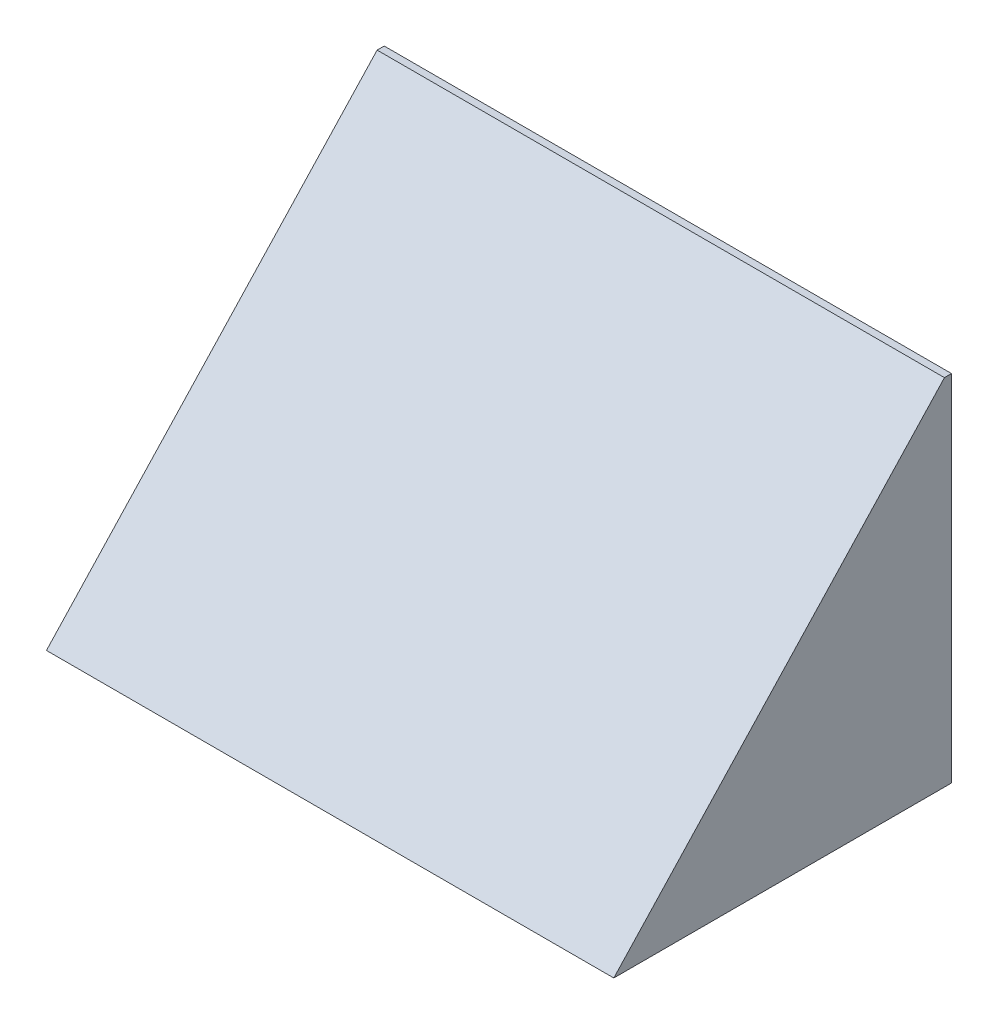
ISO-10303-21;
HEADER;
FILE_DESCRIPTION(('STEP AP214'),'2;1');
FILE_NAME('part.step','',(''),(''),'','','');
FILE_SCHEMA(('AUTOMOTIVE_DESIGN { 1 0 10303 214 1 1 1 1 }'));
ENDSEC;
DATA;
#1=APPLICATION_CONTEXT('core data for automotive mechanical design processes');
#2=APPLICATION_PROTOCOL_DEFINITION('international standard','automotive_design',2000,#1);
#3=PRODUCT_CONTEXT('',#1,'mechanical');
#4=PRODUCT('Part','Part','',(#3));
#5=PRODUCT_RELATED_PRODUCT_CATEGORY('part','',(#4));
#6=PRODUCT_DEFINITION_FORMATION('','',#4);
#7=PRODUCT_DEFINITION_CONTEXT('part definition',#1,'design');
#8=PRODUCT_DEFINITION('design','',#6,#7);
#9=PRODUCT_DEFINITION_SHAPE('','',#8);
#10=(LENGTH_UNIT() NAMED_UNIT(*) SI_UNIT(.MILLI.,.METRE.));
#11=(NAMED_UNIT(*) PLANE_ANGLE_UNIT() SI_UNIT($,.RADIAN.));
#12=(NAMED_UNIT(*) SI_UNIT($,.STERADIAN.) SOLID_ANGLE_UNIT());
#13=UNCERTAINTY_MEASURE_WITH_UNIT(LENGTH_MEASURE(1.E-05),#10,'distance_accuracy_value','');
#14=(GEOMETRIC_REPRESENTATION_CONTEXT(3) GLOBAL_UNCERTAINTY_ASSIGNED_CONTEXT((#13)) GLOBAL_UNIT_ASSIGNED_CONTEXT((#10,
#11,#12)) REPRESENTATION_CONTEXT('',''));
#15=CARTESIAN_POINT('',(0.,0.,0.));
#16=DIRECTION('',(0.,0.,1.));
#17=DIRECTION('',(1.,0.,0.));
#18=AXIS2_PLACEMENT_3D('',#15,#16,#17);
#19=CARTESIAN_POINT('',(40.,25.,0.999999999999993));
#20=DIRECTION('',(-1.,0.,0.));
#21=DIRECTION('',(0.,-1.,0.));
#22=AXIS2_PLACEMENT_3D('',#19,#20,#21);
#23=PLANE('',#22);
#24=DIRECTION('',(0.,1.,0.));
#25=VECTOR('',#24,1.);
#26=CARTESIAN_POINT('',(40.,25.,0.));
#27=LINE('',#26,#25);
#28=CARTESIAN_POINT('',(40.,-25.,0.));
#29=VERTEX_POINT('',#28);
#30=CARTESIAN_POINT('',(40.,25.,0.));
#31=VERTEX_POINT('',#30);
#32=EDGE_CURVE('E86',#29,#31,#27,.T.);
#33=ORIENTED_EDGE('',*,*,#32,.T.);
#34=DIRECTION('',(0.,0.,-1.));
#35=VECTOR('',#34,1.);
#36=CARTESIAN_POINT('',(40.,25.,0.999999999999993));
#37=LINE('',#36,#35);
#38=CARTESIAN_POINT('',(40.,25.,0.999999999999993));
#39=VERTEX_POINT('',#38);
#40=EDGE_CURVE('E11',#39,#31,#37,.T.);
#41=ORIENTED_EDGE('',*,*,#40,.F.);
#42=DIRECTION('',(0.,0.731353701619169,-0.6819983600625));
#43=VECTOR('',#42,1.);
#44=CARTESIAN_POINT('',(40.,25.,0.999999999999993));
#45=LINE('',#44,#43);
#46=CARTESIAN_POINT('',(40.,-25.,47.6257543068832));
#47=VERTEX_POINT('',#46);
#48=EDGE_CURVE('E78',#47,#39,#45,.T.);
#49=ORIENTED_EDGE('',*,*,#48,.F.);
#50=DIRECTION('',(0.,0.,-1.));
#51=VECTOR('',#50,1.);
#52=CARTESIAN_POINT('',(40.,-25.,0.999999999999993));
#53=LINE('',#52,#51);
#54=EDGE_CURVE('E87',#47,#29,#53,.T.);
#55=ORIENTED_EDGE('',*,*,#54,.T.);
#56=EDGE_LOOP('',(#33,#41,#49,#55));
#57=FACE_BOUND('',#56,.T.);
#58=ADVANCED_FACE('F33',(#57),#23,.F.);
#59=CARTESIAN_POINT('',(-40.,25.,0.999999999999993));
#60=DIRECTION('',(0.,-1.,0.));
#61=DIRECTION('',(0.,0.,-1.));
#62=AXIS2_PLACEMENT_3D('',#59,#60,#61);
#63=PLANE('',#62);
#64=DIRECTION('',(-1.,0.,0.));
#65=VECTOR('',#64,1.);
#66=CARTESIAN_POINT('',(-40.,25.,0.));
#67=LINE('',#66,#65);
#68=CARTESIAN_POINT('',(-40.,25.,0.));
#69=VERTEX_POINT('',#68);
#70=EDGE_CURVE('E90',#31,#69,#67,.T.);
#71=ORIENTED_EDGE('',*,*,#70,.T.);
#72=DIRECTION('',(0.,0.,-1.));
#73=VECTOR('',#72,1.);
#74=CARTESIAN_POINT('',(-40.,25.,0.999999999999993));
#75=LINE('',#74,#73);
#76=CARTESIAN_POINT('',(-40.,25.,0.999999999999993));
#77=VERTEX_POINT('',#76);
#78=EDGE_CURVE('E43',#77,#69,#75,.T.);
#79=ORIENTED_EDGE('',*,*,#78,.F.);
#80=DIRECTION('',(-1.,0.,0.));
#81=VECTOR('',#80,1.);
#82=CARTESIAN_POINT('',(-40.,25.,0.999999999999993));
#83=LINE('',#82,#81);
#84=EDGE_CURVE('E72',#39,#77,#83,.T.);
#85=ORIENTED_EDGE('',*,*,#84,.F.);
#86=ORIENTED_EDGE('',*,*,#40,.T.);
#87=EDGE_LOOP('',(#71,#79,#85,#86));
#88=FACE_BOUND('',#87,.T.);
#89=ADVANCED_FACE('F73',(#88),#63,.F.);
#90=CARTESIAN_POINT('',(-40.,25.,0.999999999999993));
#91=DIRECTION('',(1.,0.,0.));
#92=DIRECTION('',(0.,0.,-1.));
#93=AXIS2_PLACEMENT_3D('',#90,#91,#92);
#94=PLANE('',#93);
#95=DIRECTION('',(0.,-1.,0.));
#96=VECTOR('',#95,1.);
#97=CARTESIAN_POINT('',(-40.,25.,0.));
#98=LINE('',#97,#96);
#99=CARTESIAN_POINT('',(-40.,-25.,0.));
#100=VERTEX_POINT('',#99);
#101=EDGE_CURVE('E92',#69,#100,#98,.T.);
#102=ORIENTED_EDGE('',*,*,#101,.T.);
#103=DIRECTION('',(0.,0.,-1.));
#104=VECTOR('',#103,1.);
#105=CARTESIAN_POINT('',(-40.,-25.,0.999999999999993));
#106=LINE('',#105,#104);
#107=CARTESIAN_POINT('',(-40.,-25.,47.6257543068832));
#108=VERTEX_POINT('',#107);
#109=EDGE_CURVE('E98',#108,#100,#106,.T.);
#110=ORIENTED_EDGE('',*,*,#109,.F.);
#111=DIRECTION('',(0.,-0.731353701619169,0.6819983600625));
#112=VECTOR('',#111,1.);
#113=CARTESIAN_POINT('',(-40.,25.,0.999999999999993));
#114=LINE('',#113,#112);
#115=EDGE_CURVE('E37',#77,#108,#114,.T.);
#116=ORIENTED_EDGE('',*,*,#115,.F.);
#117=ORIENTED_EDGE('',*,*,#78,.T.);
#118=EDGE_LOOP('',(#102,#110,#116,#117));
#119=FACE_BOUND('',#118,.T.);
#120=ADVANCED_FACE('F103',(#119),#94,.F.);
#121=CARTESIAN_POINT('',(-40.,-25.,0.999999999999993));
#122=DIRECTION('',(0.,1.,0.));
#123=DIRECTION('',(0.,0.,1.));
#124=AXIS2_PLACEMENT_3D('',#121,#122,#123);
#125=PLANE('',#124);
#126=DIRECTION('',(1.,0.,0.));
#127=VECTOR('',#126,1.);
#128=CARTESIAN_POINT('',(-40.,-25.,0.));
#129=LINE('',#128,#127);
#130=EDGE_CURVE('E83',#100,#29,#129,.T.);
#131=ORIENTED_EDGE('',*,*,#130,.T.);
#132=ORIENTED_EDGE('',*,*,#54,.F.);
#133=DIRECTION('',(1.,0.,0.));
#134=VECTOR('',#133,1.);
#135=CARTESIAN_POINT('',(-40.,-25.,47.6257543068832));
#136=LINE('',#135,#134);
#137=EDGE_CURVE('E50',#108,#47,#136,.T.);
#138=ORIENTED_EDGE('',*,*,#137,.F.);
#139=ORIENTED_EDGE('',*,*,#109,.T.);
#140=EDGE_LOOP('',(#131,#132,#138,#139));
#141=FACE_BOUND('',#140,.T.);
#142=ADVANCED_FACE('F106',(#141),#125,.F.);
#143=CARTESIAN_POINT('',(-40.,25.,0.999999999999993));
#144=DIRECTION('',(0.,0.6819983600625,0.731353701619169));
#145=DIRECTION('',(0.,-0.731353701619169,0.6819983600625));
#146=AXIS2_PLACEMENT_3D('',#143,#144,#145);
#147=PLANE('',#146);
#148=ORIENTED_EDGE('',*,*,#48,.T.);
#149=ORIENTED_EDGE('',*,*,#84,.T.);
#150=ORIENTED_EDGE('',*,*,#115,.T.);
#151=ORIENTED_EDGE('',*,*,#137,.T.);
#152=EDGE_LOOP('',(#148,#149,#150,#151));
#153=FACE_BOUND('',#152,.T.);
#154=ADVANCED_FACE('F35',(#153),#147,.T.);
#155=CARTESIAN_POINT('',(0.,0.,0.));
#156=DIRECTION('',(0.,0.,1.));
#157=DIRECTION('',(1.,0.,0.));
#158=AXIS2_PLACEMENT_3D('',#155,#156,#157);
#159=PLANE('',#158);
#160=ORIENTED_EDGE('',*,*,#32,.F.);
#161=ORIENTED_EDGE('',*,*,#130,.F.);
#162=ORIENTED_EDGE('',*,*,#101,.F.);
#163=ORIENTED_EDGE('',*,*,#70,.F.);
#164=EDGE_LOOP('',(#160,#161,#162,#163));
#165=FACE_BOUND('',#164,.T.);
#166=ADVANCED_FACE('F107',(#165),#159,.F.);
#167=CLOSED_SHELL('',(#58,#89,#120,#142,#154,#166));
#168=MANIFOLD_SOLID_BREP('B2',#167);
#169=ADVANCED_BREP_SHAPE_REPRESENTATION('',(#18,#168),#14);
#170=SHAPE_DEFINITION_REPRESENTATION(#9,#169);
ENDSEC;
END-ISO-10303-21;
